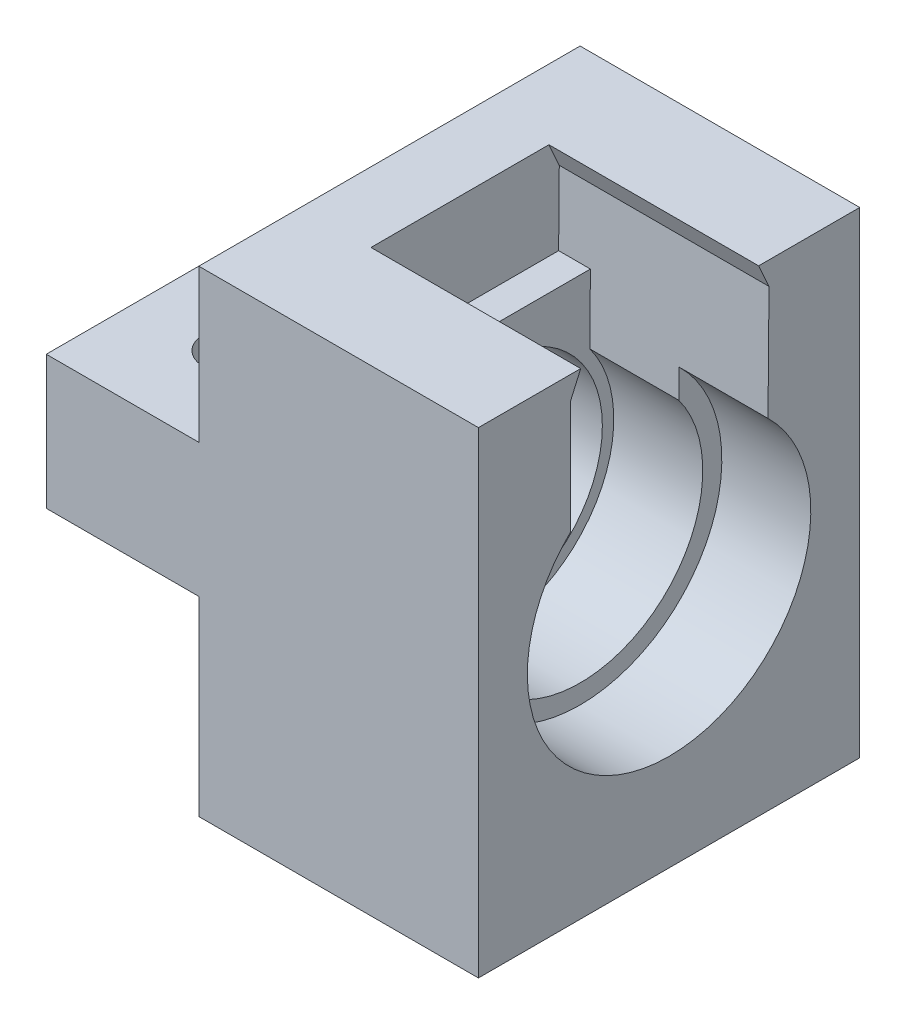
ISO-10303-21;
HEADER;
FILE_DESCRIPTION(('STEP AP214'),'2;1');
FILE_NAME('part.step','',(''),(''),'','','');
FILE_SCHEMA(('AUTOMOTIVE_DESIGN { 1 0 10303 214 1 1 1 1 }'));
ENDSEC;
DATA;
#1=APPLICATION_CONTEXT('core data for automotive mechanical design processes');
#2=APPLICATION_PROTOCOL_DEFINITION('international standard','automotive_design',2000,#1);
#3=PRODUCT_CONTEXT('',#1,'mechanical');
#4=PRODUCT('Part','Part','',(#3));
#5=PRODUCT_RELATED_PRODUCT_CATEGORY('part','',(#4));
#6=PRODUCT_DEFINITION_FORMATION('','',#4);
#7=PRODUCT_DEFINITION_CONTEXT('part definition',#1,'design');
#8=PRODUCT_DEFINITION('design','',#6,#7);
#9=PRODUCT_DEFINITION_SHAPE('','',#8);
#10=(LENGTH_UNIT() NAMED_UNIT(*) SI_UNIT(.MILLI.,.METRE.));
#11=(NAMED_UNIT(*) PLANE_ANGLE_UNIT() SI_UNIT($,.RADIAN.));
#12=(NAMED_UNIT(*) SI_UNIT($,.STERADIAN.) SOLID_ANGLE_UNIT());
#13=UNCERTAINTY_MEASURE_WITH_UNIT(LENGTH_MEASURE(1.E-05),#10,'distance_accuracy_value','');
#14=(GEOMETRIC_REPRESENTATION_CONTEXT(3) GLOBAL_UNCERTAINTY_ASSIGNED_CONTEXT((#13)) GLOBAL_UNIT_ASSIGNED_CONTEXT((#10,
#11,#12)) REPRESENTATION_CONTEXT('',''));
#15=CARTESIAN_POINT('',(0.,0.,0.));
#16=DIRECTION('',(0.,0.,1.));
#17=DIRECTION('',(1.,0.,0.));
#18=AXIS2_PLACEMENT_3D('',#15,#16,#17);
#19=CARTESIAN_POINT('',(-34.,6.75,30.));
#20=DIRECTION('',(0.,-1.,0.));
#21=DIRECTION('',(1.,0.,0.));
#22=AXIS2_PLACEMENT_3D('',#19,#20,#21);
#23=PLANE('',#22);
#24=DIRECTION('',(-1.,0.,0.));
#25=VECTOR('',#24,1.);
#26=CARTESIAN_POINT('',(-34.,6.75,0.));
#27=LINE('',#26,#25);
#28=CARTESIAN_POINT('',(-22.,6.75,0.));
#29=VERTEX_POINT('',#28);
#30=CARTESIAN_POINT('',(-34.,6.75,0.));
#31=VERTEX_POINT('',#30);
#32=EDGE_CURVE('E173',#29,#31,#27,.T.);
#33=ORIENTED_EDGE('',*,*,#32,.T.);
#34=DIRECTION('',(0.,0.,-1.));
#35=VECTOR('',#34,1.);
#36=CARTESIAN_POINT('',(-34.,6.75,30.));
#37=LINE('',#36,#35);
#38=CARTESIAN_POINT('',(-34.,6.75,30.));
#39=VERTEX_POINT('',#38);
#40=EDGE_CURVE('E193',#39,#31,#37,.T.);
#41=ORIENTED_EDGE('',*,*,#40,.F.);
#42=DIRECTION('',(-1.,0.,0.));
#43=VECTOR('',#42,1.);
#44=CARTESIAN_POINT('',(-34.,6.75,30.));
#45=LINE('',#44,#43);
#46=CARTESIAN_POINT('',(-22.,6.75,30.));
#47=VERTEX_POINT('',#46);
#48=EDGE_CURVE('E202',#47,#39,#45,.T.);
#49=ORIENTED_EDGE('',*,*,#48,.F.);
#50=DIRECTION('',(0.,0.,-1.));
#51=VECTOR('',#50,1.);
#52=CARTESIAN_POINT('',(-22.,6.75,30.));
#53=LINE('',#52,#51);
#54=EDGE_CURVE('E67',#47,#29,#53,.T.);
#55=ORIENTED_EDGE('',*,*,#54,.T.);
#56=EDGE_LOOP('',(#33,#41,#49,#55));
#57=FACE_BOUND('',#56,.T.);
#58=CARTESIAN_POINT('',(-27.,6.75,22.5));
#59=DIRECTION('',(0.,1.,0.));
#60=DIRECTION('',(0.,0.,1.));
#61=AXIS2_PLACEMENT_3D('',#58,#59,#60);
#62=CIRCLE('',#61,2.15);
#63=CARTESIAN_POINT('',(-27.,6.75,24.65));
#64=VERTEX_POINT('',#63);
#65=EDGE_CURVE('E309',#64,#64,#62,.F.);
#66=ORIENTED_EDGE('',*,*,#65,.T.);
#67=EDGE_LOOP('',(#66));
#68=FACE_BOUND('',#67,.T.);
#69=CARTESIAN_POINT('',(-27.,6.75,7.5));
#70=DIRECTION('',(0.,1.,0.));
#71=DIRECTION('',(0.,0.,1.));
#72=AXIS2_PLACEMENT_3D('',#69,#70,#71);
#73=CIRCLE('',#72,2.15);
#74=CARTESIAN_POINT('',(-27.,6.75,9.65));
#75=VERTEX_POINT('',#74);
#76=EDGE_CURVE('E312',#75,#75,#73,.T.);
#77=ORIENTED_EDGE('',*,*,#76,.F.);
#78=EDGE_LOOP('',(#77));
#79=FACE_BOUND('',#78,.T.);
#80=ADVANCED_FACE('F58',(#57,#68,#79),#23,.F.);
#81=CARTESIAN_POINT('',(-22.,-3.75,30.));
#82=DIRECTION('',(0.,1.,0.));
#83=DIRECTION('',(-1.,0.,0.));
#84=AXIS2_PLACEMENT_3D('',#81,#82,#83);
#85=PLANE('',#84);
#86=DIRECTION('',(1.,0.,0.));
#87=VECTOR('',#86,1.);
#88=CARTESIAN_POINT('',(-22.,-3.75,0.));
#89=LINE('',#88,#87);
#90=CARTESIAN_POINT('',(-34.,-3.75,0.));
#91=VERTEX_POINT('',#90);
#92=CARTESIAN_POINT('',(-22.,-3.75,0.));
#93=VERTEX_POINT('',#92);
#94=EDGE_CURVE('E177',#91,#93,#89,.T.);
#95=ORIENTED_EDGE('',*,*,#94,.T.);
#96=DIRECTION('',(0.,0.,-1.));
#97=VECTOR('',#96,1.);
#98=CARTESIAN_POINT('',(-22.,-3.75,30.));
#99=LINE('',#98,#97);
#100=CARTESIAN_POINT('',(-22.,-3.75,30.));
#101=VERTEX_POINT('',#100);
#102=EDGE_CURVE('E159',#101,#93,#99,.T.);
#103=ORIENTED_EDGE('',*,*,#102,.F.);
#104=DIRECTION('',(1.,0.,0.));
#105=VECTOR('',#104,1.);
#106=CARTESIAN_POINT('',(-22.,-3.75,30.));
#107=LINE('',#106,#105);
#108=CARTESIAN_POINT('',(-34.,-3.75,30.));
#109=VERTEX_POINT('',#108);
#110=EDGE_CURVE('E147',#109,#101,#107,.T.);
#111=ORIENTED_EDGE('',*,*,#110,.F.);
#112=DIRECTION('',(0.,0.,-1.));
#113=VECTOR('',#112,1.);
#114=CARTESIAN_POINT('',(-34.,-3.75,30.));
#115=LINE('',#114,#113);
#116=EDGE_CURVE('E190',#109,#91,#115,.T.);
#117=ORIENTED_EDGE('',*,*,#116,.T.);
#118=EDGE_LOOP('',(#95,#103,#111,#117));
#119=FACE_BOUND('',#118,.T.);
#120=CARTESIAN_POINT('',(-27.,-3.75,22.5));
#121=DIRECTION('',(0.,1.,0.));
#122=DIRECTION('',(-1.,0.,0.));
#123=AXIS2_PLACEMENT_3D('',#120,#121,#122);
#124=CIRCLE('',#123,2.15);
#125=CARTESIAN_POINT('',(-29.15,-3.75,22.5));
#126=VERTEX_POINT('',#125);
#127=EDGE_CURVE('E306',#126,#126,#124,.T.);
#128=ORIENTED_EDGE('',*,*,#127,.T.);
#129=EDGE_LOOP('',(#128));
#130=FACE_BOUND('',#129,.T.);
#131=CARTESIAN_POINT('',(-27.,-3.75,7.5));
#132=DIRECTION('',(0.,1.,0.));
#133=DIRECTION('',(-1.,0.,0.));
#134=AXIS2_PLACEMENT_3D('',#131,#132,#133);
#135=CIRCLE('',#134,2.15);
#136=CARTESIAN_POINT('',(-29.15,-3.75,7.5));
#137=VERTEX_POINT('',#136);
#138=EDGE_CURVE('E305',#137,#137,#135,.F.);
#139=ORIENTED_EDGE('',*,*,#138,.F.);
#140=EDGE_LOOP('',(#139));
#141=FACE_BOUND('',#140,.T.);
#142=ADVANCED_FACE('F213',(#119,#130,#141),#85,.F.);
#143=CARTESIAN_POINT('',(-22.,18.75,30.));
#144=DIRECTION('',(0.,-1.,0.));
#145=DIRECTION('',(1.,0.,0.));
#146=AXIS2_PLACEMENT_3D('',#143,#144,#145);
#147=PLANE('',#146);
#148=DIRECTION('',(1.,0.,0.));
#149=VECTOR('',#148,1.);
#150=CARTESIAN_POINT('',(-14.,18.75,21.9532092170405));
#151=LINE('',#150,#149);
#152=CARTESIAN_POINT('',(-16.5,18.75,21.9532092170405));
#153=VERTEX_POINT('',#152);
#154=CARTESIAN_POINT('',(0.,18.75,21.9532092170405));
#155=VERTEX_POINT('',#154);
#156=EDGE_CURVE('E241',#153,#155,#151,.T.);
#157=ORIENTED_EDGE('',*,*,#156,.F.);
#158=DIRECTION('',(0.,0.,1.));
#159=VECTOR('',#158,1.);
#160=CARTESIAN_POINT('',(-16.5,18.75,0.));
#161=LINE('',#160,#159);
#162=CARTESIAN_POINT('',(-16.5,18.75,7.95210770828627));
#163=VERTEX_POINT('',#162);
#164=EDGE_CURVE('E285',#163,#153,#161,.T.);
#165=ORIENTED_EDGE('',*,*,#164,.F.);
#166=DIRECTION('',(1.,0.,0.));
#167=VECTOR('',#166,1.);
#168=CARTESIAN_POINT('',(-14.,18.75,7.95210770828627));
#169=LINE('',#168,#167);
#170=CARTESIAN_POINT('',(0.,18.75,7.95210770828627));
#171=VERTEX_POINT('',#170);
#172=EDGE_CURVE('E238',#163,#171,#169,.T.);
#173=ORIENTED_EDGE('',*,*,#172,.T.);
#174=DIRECTION('',(0.,0.,-1.));
#175=VECTOR('',#174,1.);
#176=CARTESIAN_POINT('',(0.,18.75,30.));
#177=LINE('',#176,#175);
#178=CARTESIAN_POINT('',(0.,18.75,0.));
#179=VERTEX_POINT('',#178);
#180=EDGE_CURVE('E117',#171,#179,#177,.T.);
#181=ORIENTED_EDGE('',*,*,#180,.T.);
#182=DIRECTION('',(-1.,0.,0.));
#183=VECTOR('',#182,1.);
#184=CARTESIAN_POINT('',(-22.,18.75,0.));
#185=LINE('',#184,#183);
#186=CARTESIAN_POINT('',(-22.,18.75,0.));
#187=VERTEX_POINT('',#186);
#188=EDGE_CURVE('E168',#179,#187,#185,.T.);
#189=ORIENTED_EDGE('',*,*,#188,.T.);
#190=DIRECTION('',(0.,0.,-1.));
#191=VECTOR('',#190,1.);
#192=CARTESIAN_POINT('',(-22.,18.75,30.));
#193=LINE('',#192,#191);
#194=CARTESIAN_POINT('',(-22.,18.75,30.));
#195=VERTEX_POINT('',#194);
#196=EDGE_CURVE('E12',#195,#187,#193,.T.);
#197=ORIENTED_EDGE('',*,*,#196,.F.);
#198=DIRECTION('',(-1.,0.,0.));
#199=VECTOR('',#198,1.);
#200=CARTESIAN_POINT('',(-22.,18.75,30.));
#201=LINE('',#200,#199);
#202=CARTESIAN_POINT('',(0.,18.75,30.));
#203=VERTEX_POINT('',#202);
#204=EDGE_CURVE('E184',#203,#195,#201,.T.);
#205=ORIENTED_EDGE('',*,*,#204,.F.);
#206=EDGE_CURVE('E185',#203,#155,#177,.T.);
#207=ORIENTED_EDGE('',*,*,#206,.T.);
#208=EDGE_LOOP('',(#157,#165,#173,#181,#189,#197,#205,#207));
#209=FACE_BOUND('',#208,.T.);
#210=ADVANCED_FACE('F60',(#209),#147,.F.);
#211=CARTESIAN_POINT('',(-14.,0.,15.));
#212=DIRECTION('',(1.,0.,0.));
#213=DIRECTION('',(0.,0.,-1.));
#214=AXIS2_PLACEMENT_3D('',#211,#212,#213);
#215=CYLINDRICAL_SURFACE('',#214,9.65);
#216=CARTESIAN_POINT('',(-7.,0.,15.));
#217=DIRECTION('',(1.,0.,0.));
#218=DIRECTION('',(0.,0.,-1.));
#219=AXIS2_PLACEMENT_3D('',#216,#217,#218);
#220=CIRCLE('',#219,9.65);
#221=CARTESIAN_POINT('',(-7.,5.74671012070965,22.7522785546272));
#222=VERTEX_POINT('',#221);
#223=CARTESIAN_POINT('',(-7.,5.73268595831545,7.23734506091293));
#224=VERTEX_POINT('',#223);
#225=EDGE_CURVE('E270',#222,#224,#220,.T.);
#226=ORIENTED_EDGE('',*,*,#225,.T.);
#227=DIRECTION('',(1.,0.,0.));
#228=VECTOR('',#227,1.);
#229=CARTESIAN_POINT('',(-14.,5.73268595831545,7.23734506091293));
#230=LINE('',#229,#228);
#231=CARTESIAN_POINT('',(-14.,5.73268595831545,7.23734506091293));
#232=VERTEX_POINT('',#231);
#233=EDGE_CURVE('E226',#224,#232,#230,.F.);
#234=ORIENTED_EDGE('',*,*,#233,.T.);
#235=CARTESIAN_POINT('',(-14.,0.,15.));
#236=DIRECTION('',(1.,0.,0.));
#237=DIRECTION('',(0.,0.,-1.));
#238=AXIS2_PLACEMENT_3D('',#235,#236,#237);
#239=CIRCLE('',#238,9.65);
#240=CARTESIAN_POINT('',(-14.,5.74671012070965,22.7522785546272));
#241=VERTEX_POINT('',#240);
#242=EDGE_CURVE('E230',#241,#232,#239,.T.);
#243=ORIENTED_EDGE('',*,*,#242,.F.);
#244=DIRECTION('',(1.,0.,0.));
#245=VECTOR('',#244,1.);
#246=CARTESIAN_POINT('',(-14.,5.74671012070965,22.7522785546272));
#247=LINE('',#246,#245);
#248=EDGE_CURVE('E223',#222,#241,#247,.F.);
#249=ORIENTED_EDGE('',*,*,#248,.F.);
#250=EDGE_LOOP('',(#226,#234,#243,#249));
#251=FACE_BOUND('',#250,.T.);
#252=ADVANCED_FACE('F335',(#251),#215,.F.);
#253=CARTESIAN_POINT('',(0.,18.75,30.));
#254=DIRECTION('',(-1.,0.,0.));
#255=DIRECTION('',(0.,0.,1.));
#256=AXIS2_PLACEMENT_3D('',#253,#254,#255);
#257=PLANE('',#256);
#258=DIRECTION('',(0.,-0.999961655665334,0.00875712276062912));
#259=VECTOR('',#258,1.);
#260=CARTESIAN_POINT('',(0.,0.0638155125891131,7.28698995892084));
#261=LINE('',#260,#259);
#262=CARTESIAN_POINT('',(0.,16.9402011889184,7.13919571072539));
#263=VERTEX_POINT('',#262);
#264=CARTESIAN_POINT('',(0.,7.98480408284201,7.21762222976617));
#265=VERTEX_POINT('',#264);
#266=EDGE_CURVE('E233',#263,#265,#261,.T.);
#267=ORIENTED_EDGE('',*,*,#266,.T.);
#268=CARTESIAN_POINT('',(0.,0.,15.));
#269=DIRECTION('',(1.,0.,0.));
#270=DIRECTION('',(0.,0.,-1.));
#271=AXIS2_PLACEMENT_3D('',#268,#269,#270);
#272=CIRCLE('',#271,11.15);
#273=CARTESIAN_POINT('',(0.,8.01495462369594,22.7513226213399));
#274=VERTEX_POINT('',#273);
#275=EDGE_CURVE('E267',#274,#265,#272,.T.);
#276=ORIENTED_EDGE('',*,*,#275,.F.);
#277=DIRECTION('',(0.,-0.999999911193372,0.000421441868906497));
#278=VECTOR('',#277,1.);
#279=CARTESIAN_POINT('',(0.,0.00958978263625245,22.7546964175594));
#280=LINE('',#279,#278);
#281=CARTESIAN_POINT('',(0.,16.9472308597508,22.747558185815));
#282=VERTEX_POINT('',#281);
#283=EDGE_CURVE('E246',#282,#274,#280,.T.);
#284=ORIENTED_EDGE('',*,*,#283,.F.);
#285=DIRECTION('',(0.,0.915103356382747,-0.403219353624094));
#286=VECTOR('',#285,1.);
#287=CARTESIAN_POINT('',(0.,11.1489418701439,25.3024415464844));
#288=LINE('',#287,#286);
#289=EDGE_CURVE('E250',#282,#155,#288,.T.);
#290=ORIENTED_EDGE('',*,*,#289,.T.);
#291=ORIENTED_EDGE('',*,*,#206,.F.);
#292=DIRECTION('',(0.,1.,0.));
#293=VECTOR('',#292,1.);
#294=CARTESIAN_POINT('',(0.,18.75,30.));
#295=LINE('',#294,#293);
#296=CARTESIAN_POINT('',(0.,-18.75,30.));
#297=VERTEX_POINT('',#296);
#298=EDGE_CURVE('E83',#297,#203,#295,.T.);
#299=ORIENTED_EDGE('',*,*,#298,.F.);
#300=DIRECTION('',(0.,0.,-1.));
#301=VECTOR('',#300,1.);
#302=CARTESIAN_POINT('',(0.,-18.75,30.));
#303=LINE('',#302,#301);
#304=CARTESIAN_POINT('',(0.,-18.75,0.));
#305=VERTEX_POINT('',#304);
#306=EDGE_CURVE('E160',#297,#305,#303,.T.);
#307=ORIENTED_EDGE('',*,*,#306,.T.);
#308=DIRECTION('',(0.,1.,0.));
#309=VECTOR('',#308,1.);
#310=CARTESIAN_POINT('',(0.,18.75,0.));
#311=LINE('',#310,#309);
#312=EDGE_CURVE('E182',#305,#179,#311,.T.);
#313=ORIENTED_EDGE('',*,*,#312,.T.);
#314=ORIENTED_EDGE('',*,*,#180,.F.);
#315=DIRECTION('',(0.,0.912203742273716,0.409736906541048));
#316=VECTOR('',#315,1.);
#317=CARTESIAN_POINT('',(0.,0.17562331241949,-0.390992952458178));
#318=LINE('',#317,#316);
#319=EDGE_CURVE('E253',#263,#171,#318,.T.);
#320=ORIENTED_EDGE('',*,*,#319,.F.);
#321=EDGE_LOOP('',(#267,#276,#284,#290,#291,#299,#307,#313,#314,#320));
#322=FACE_BOUND('',#321,.T.);
#323=ADVANCED_FACE('F330',(#322),#257,.F.);
#324=CARTESIAN_POINT('',(-22.,6.75,30.));
#325=DIRECTION('',(1.,0.,0.));
#326=DIRECTION('',(0.,0.,-1.));
#327=AXIS2_PLACEMENT_3D('',#324,#325,#326);
#328=PLANE('',#327);
#329=DIRECTION('',(0.,-1.,0.));
#330=VECTOR('',#329,1.);
#331=CARTESIAN_POINT('',(-22.,6.75,0.));
#332=LINE('',#331,#330);
#333=EDGE_CURVE('E170',#187,#29,#332,.T.);
#334=ORIENTED_EDGE('',*,*,#333,.T.);
#335=ORIENTED_EDGE('',*,*,#54,.F.);
#336=DIRECTION('',(0.,-1.,0.));
#337=VECTOR('',#336,1.);
#338=CARTESIAN_POINT('',(-22.,6.75,30.));
#339=LINE('',#338,#337);
#340=EDGE_CURVE('E125',#195,#47,#339,.T.);
#341=ORIENTED_EDGE('',*,*,#340,.F.);
#342=ORIENTED_EDGE('',*,*,#196,.T.);
#343=EDGE_LOOP('',(#334,#335,#341,#342));
#344=FACE_BOUND('',#343,.T.);
#345=ADVANCED_FACE('F328',(#344),#328,.F.);
#346=CARTESIAN_POINT('',(-34.,-3.75,30.));
#347=DIRECTION('',(1.,0.,0.));
#348=DIRECTION('',(0.,0.,-1.));
#349=AXIS2_PLACEMENT_3D('',#346,#347,#348);
#350=PLANE('',#349);
#351=DIRECTION('',(0.,-1.,0.));
#352=VECTOR('',#351,1.);
#353=CARTESIAN_POINT('',(-34.,-3.75,0.));
#354=LINE('',#353,#352);
#355=EDGE_CURVE('E175',#31,#91,#354,.T.);
#356=ORIENTED_EDGE('',*,*,#355,.T.);
#357=ORIENTED_EDGE('',*,*,#116,.F.);
#358=DIRECTION('',(0.,-1.,0.));
#359=VECTOR('',#358,1.);
#360=CARTESIAN_POINT('',(-34.,-3.75,30.));
#361=LINE('',#360,#359);
#362=EDGE_CURVE('E215',#39,#109,#361,.T.);
#363=ORIENTED_EDGE('',*,*,#362,.F.);
#364=ORIENTED_EDGE('',*,*,#40,.T.);
#365=EDGE_LOOP('',(#356,#357,#363,#364));
#366=FACE_BOUND('',#365,.T.);
#367=ADVANCED_FACE('F210',(#366),#350,.F.);
#368=CARTESIAN_POINT('',(-22.,-18.75,30.));
#369=DIRECTION('',(1.,0.,0.));
#370=DIRECTION('',(0.,0.,-1.));
#371=AXIS2_PLACEMENT_3D('',#368,#369,#370);
#372=PLANE('',#371);
#373=DIRECTION('',(0.,-1.,0.));
#374=VECTOR('',#373,1.);
#375=CARTESIAN_POINT('',(-22.,-18.75,0.));
#376=LINE('',#375,#374);
#377=CARTESIAN_POINT('',(-22.,-18.75,0.));
#378=VERTEX_POINT('',#377);
#379=EDGE_CURVE('E156',#93,#378,#376,.T.);
#380=ORIENTED_EDGE('',*,*,#379,.T.);
#381=DIRECTION('',(0.,0.,-1.));
#382=VECTOR('',#381,1.);
#383=CARTESIAN_POINT('',(-22.,-18.75,30.));
#384=LINE('',#383,#382);
#385=CARTESIAN_POINT('',(-22.,-18.75,30.));
#386=VERTEX_POINT('',#385);
#387=EDGE_CURVE('E153',#386,#378,#384,.T.);
#388=ORIENTED_EDGE('',*,*,#387,.F.);
#389=DIRECTION('',(0.,-1.,0.));
#390=VECTOR('',#389,1.);
#391=CARTESIAN_POINT('',(-22.,-18.75,30.));
#392=LINE('',#391,#390);
#393=EDGE_CURVE('E140',#101,#386,#392,.T.);
#394=ORIENTED_EDGE('',*,*,#393,.F.);
#395=ORIENTED_EDGE('',*,*,#102,.T.);
#396=EDGE_LOOP('',(#380,#388,#394,#395));
#397=FACE_BOUND('',#396,.T.);
#398=ADVANCED_FACE('F154',(#397),#372,.F.);
#399=CARTESIAN_POINT('',(0.,-18.75,30.));
#400=DIRECTION('',(0.,1.,0.));
#401=DIRECTION('',(0.,0.,1.));
#402=AXIS2_PLACEMENT_3D('',#399,#400,#401);
#403=PLANE('',#402);
#404=DIRECTION('',(1.,0.,0.));
#405=VECTOR('',#404,1.);
#406=CARTESIAN_POINT('',(0.,-18.75,0.));
#407=LINE('',#406,#405);
#408=EDGE_CURVE('E180',#378,#305,#407,.T.);
#409=ORIENTED_EDGE('',*,*,#408,.T.);
#410=ORIENTED_EDGE('',*,*,#306,.F.);
#411=DIRECTION('',(1.,0.,0.));
#412=VECTOR('',#411,1.);
#413=CARTESIAN_POINT('',(0.,-18.75,30.));
#414=LINE('',#413,#412);
#415=EDGE_CURVE('E144',#386,#297,#414,.T.);
#416=ORIENTED_EDGE('',*,*,#415,.F.);
#417=ORIENTED_EDGE('',*,*,#387,.T.);
#418=EDGE_LOOP('',(#409,#410,#416,#417));
#419=FACE_BOUND('',#418,.T.);
#420=ADVANCED_FACE('F162',(#419),#403,.F.);
#421=CARTESIAN_POINT('',(0.,0.,30.));
#422=DIRECTION('',(0.,0.,-1.));
#423=DIRECTION('',(-1.,0.,0.));
#424=AXIS2_PLACEMENT_3D('',#421,#422,#423);
#425=PLANE('',#424);
#426=ORIENTED_EDGE('',*,*,#204,.T.);
#427=ORIENTED_EDGE('',*,*,#340,.T.);
#428=ORIENTED_EDGE('',*,*,#48,.T.);
#429=ORIENTED_EDGE('',*,*,#362,.T.);
#430=ORIENTED_EDGE('',*,*,#110,.T.);
#431=ORIENTED_EDGE('',*,*,#393,.T.);
#432=ORIENTED_EDGE('',*,*,#415,.T.);
#433=ORIENTED_EDGE('',*,*,#298,.T.);
#434=EDGE_LOOP('',(#426,#427,#428,#429,#430,#431,#432,#433));
#435=FACE_BOUND('',#434,.T.);
#436=ADVANCED_FACE('F142',(#435),#425,.F.);
#437=CARTESIAN_POINT('',(0.,0.,0.));
#438=DIRECTION('',(0.,0.,-1.));
#439=DIRECTION('',(-1.,0.,0.));
#440=AXIS2_PLACEMENT_3D('',#437,#438,#439);
#441=PLANE('',#440);
#442=ORIENTED_EDGE('',*,*,#188,.F.);
#443=ORIENTED_EDGE('',*,*,#312,.F.);
#444=ORIENTED_EDGE('',*,*,#408,.F.);
#445=ORIENTED_EDGE('',*,*,#379,.F.);
#446=ORIENTED_EDGE('',*,*,#94,.F.);
#447=ORIENTED_EDGE('',*,*,#355,.F.);
#448=ORIENTED_EDGE('',*,*,#32,.F.);
#449=ORIENTED_EDGE('',*,*,#333,.F.);
#450=EDGE_LOOP('',(#442,#443,#444,#445,#446,#447,#448,#449));
#451=FACE_BOUND('',#450,.T.);
#452=ADVANCED_FACE('F206',(#451),#441,.T.);
#453=CARTESIAN_POINT('',(-14.,0.,0.));
#454=DIRECTION('',(1.,0.,0.));
#455=DIRECTION('',(0.,0.,-1.));
#456=AXIS2_PLACEMENT_3D('',#453,#454,#455);
#457=PLANE('',#456);
#458=DIRECTION('',(0.,0.,-1.));
#459=VECTOR('',#458,1.);
#460=CARTESIAN_POINT('',(-14.,11.15,0.));
#461=LINE('',#460,#459);
#462=CARTESIAN_POINT('',(-14.,11.15,22.75000138184));
#463=VERTEX_POINT('',#462);
#464=CARTESIAN_POINT('',(-14.,11.15,7.1899031576888));
#465=VERTEX_POINT('',#464);
#466=EDGE_CURVE('E271',#463,#465,#461,.T.);
#467=ORIENTED_EDGE('',*,*,#466,.F.);
#468=DIRECTION('',(0.,-0.999999911193372,0.000421441868906497));
#469=VECTOR('',#468,1.);
#470=CARTESIAN_POINT('',(-14.,0.00958978263625245,22.7546964175594));
#471=LINE('',#470,#469);
#472=EDGE_CURVE('E239',#463,#241,#471,.T.);
#473=ORIENTED_EDGE('',*,*,#472,.T.);
#474=ORIENTED_EDGE('',*,*,#242,.T.);
#475=DIRECTION('',(0.,-0.999961655665334,0.00875712276062912));
#476=VECTOR('',#475,1.);
#477=CARTESIAN_POINT('',(-14.,0.0638155125891131,7.28698995892084));
#478=LINE('',#477,#476);
#479=EDGE_CURVE('E249',#465,#232,#478,.T.);
#480=ORIENTED_EDGE('',*,*,#479,.F.);
#481=EDGE_LOOP('',(#467,#473,#474,#480));
#482=FACE_BOUND('',#481,.T.);
#483=CARTESIAN_POINT('',(-14.,0.,15.));
#484=DIRECTION('',(1.,0.,0.));
#485=DIRECTION('',(0.,0.,-1.));
#486=AXIS2_PLACEMENT_3D('',#483,#484,#485);
#487=CIRCLE('',#486,8.75);
#488=CARTESIAN_POINT('',(-14.,0.,6.25));
#489=VERTEX_POINT('',#488);
#490=EDGE_CURVE('E62',#489,#489,#487,.F.);
#491=ORIENTED_EDGE('',*,*,#490,.T.);
#492=EDGE_LOOP('',(#491));
#493=FACE_BOUND('',#492,.T.);
#494=ADVANCED_FACE('F369',(#482,#493),#457,.T.);
#495=CARTESIAN_POINT('',(-14.,0.00958978263625245,22.7546964175594));
#496=DIRECTION('',(0.,0.000421441868906497,0.999999911193372));
#497=DIRECTION('',(0.,-0.999999911193372,0.000421441868906497));
#498=AXIS2_PLACEMENT_3D('',#495,#496,#497);
#499=PLANE('',#498);
#500=ORIENTED_EDGE('',*,*,#472,.F.);
#501=DIRECTION('',(1.,0.,0.));
#502=VECTOR('',#501,1.);
#503=CARTESIAN_POINT('',(-16.5,11.15,22.75000138184));
#504=LINE('',#503,#502);
#505=CARTESIAN_POINT('',(-16.5,11.15,22.75000138184));
#506=VERTEX_POINT('',#505);
#507=EDGE_CURVE('E282',#506,#463,#504,.T.);
#508=ORIENTED_EDGE('',*,*,#507,.F.);
#509=DIRECTION('',(0.,-0.999999911193372,0.000421441868906497));
#510=VECTOR('',#509,1.);
#511=CARTESIAN_POINT('',(-16.5,0.00958978263625245,22.7546964175594));
#512=LINE('',#511,#510);
#513=CARTESIAN_POINT('',(-16.5,16.9472308597508,22.747558185815));
#514=VERTEX_POINT('',#513);
#515=EDGE_CURVE('E299',#514,#506,#512,.T.);
#516=ORIENTED_EDGE('',*,*,#515,.F.);
#517=DIRECTION('',(1.,0.,0.));
#518=VECTOR('',#517,1.);
#519=CARTESIAN_POINT('',(-14.,16.9472308597508,22.747558185815));
#520=LINE('',#519,#518);
#521=EDGE_CURVE('E229',#514,#282,#520,.T.);
#522=ORIENTED_EDGE('',*,*,#521,.T.);
#523=ORIENTED_EDGE('',*,*,#283,.T.);
#524=DIRECTION('',(1.,0.,0.));
#525=VECTOR('',#524,1.);
#526=CARTESIAN_POINT('',(-7.,8.01495462369594,22.7513226213399));
#527=LINE('',#526,#525);
#528=CARTESIAN_POINT('',(-7.,8.01495462369594,22.7513226213399));
#529=VERTEX_POINT('',#528);
#530=EDGE_CURVE('E262',#529,#274,#527,.T.);
#531=ORIENTED_EDGE('',*,*,#530,.F.);
#532=DIRECTION('',(0.,-0.999999911193372,0.000421441868906497));
#533=VECTOR('',#532,1.);
#534=CARTESIAN_POINT('',(-7.,0.00958978263625245,22.7546964175594));
#535=LINE('',#534,#533);
#536=EDGE_CURVE('E275',#529,#222,#535,.T.);
#537=ORIENTED_EDGE('',*,*,#536,.T.);
#538=ORIENTED_EDGE('',*,*,#248,.T.);
#539=EDGE_LOOP('',(#500,#508,#516,#522,#523,#531,#537,#538));
#540=FACE_BOUND('',#539,.T.);
#541=ADVANCED_FACE('F373',(#540),#499,.F.);
#542=CARTESIAN_POINT('',(-14.,11.1489418701439,25.3024415464844));
#543=DIRECTION('',(0.,-0.403219353624094,-0.915103356382747));
#544=DIRECTION('',(0.,0.915103356382747,-0.403219353624094));
#545=AXIS2_PLACEMENT_3D('',#542,#543,#544);
#546=PLANE('',#545);
#547=ORIENTED_EDGE('',*,*,#289,.F.);
#548=ORIENTED_EDGE('',*,*,#521,.F.);
#549=DIRECTION('',(0.,0.915103356382747,-0.403219353624094));
#550=VECTOR('',#549,1.);
#551=CARTESIAN_POINT('',(-16.5,11.1489418701439,25.3024415464844));
#552=LINE('',#551,#550);
#553=EDGE_CURVE('E302',#514,#153,#552,.T.);
#554=ORIENTED_EDGE('',*,*,#553,.T.);
#555=ORIENTED_EDGE('',*,*,#156,.T.);
#556=EDGE_LOOP('',(#547,#548,#554,#555));
#557=FACE_BOUND('',#556,.T.);
#558=ADVANCED_FACE('F431',(#557),#546,.T.);
#559=CARTESIAN_POINT('',(-14.,0.17562331241949,-0.390992952458178));
#560=DIRECTION('',(0.,0.409736906541048,-0.912203742273716));
#561=DIRECTION('',(0.,0.912203742273716,0.409736906541048));
#562=AXIS2_PLACEMENT_3D('',#559,#560,#561);
#563=PLANE('',#562);
#564=ORIENTED_EDGE('',*,*,#319,.T.);
#565=ORIENTED_EDGE('',*,*,#172,.F.);
#566=DIRECTION('',(0.,0.912203742273716,0.409736906541048));
#567=VECTOR('',#566,1.);
#568=CARTESIAN_POINT('',(-16.5,0.17562331241949,-0.390992952458178));
#569=LINE('',#568,#567);
#570=CARTESIAN_POINT('',(-16.5,16.9402011889184,7.13919571072539));
#571=VERTEX_POINT('',#570);
#572=EDGE_CURVE('E290',#571,#163,#569,.T.);
#573=ORIENTED_EDGE('',*,*,#572,.F.);
#574=DIRECTION('',(1.,0.,0.));
#575=VECTOR('',#574,1.);
#576=CARTESIAN_POINT('',(-14.,16.9402011889184,7.13919571072539));
#577=LINE('',#576,#575);
#578=EDGE_CURVE('E235',#571,#263,#577,.T.);
#579=ORIENTED_EDGE('',*,*,#578,.T.);
#580=EDGE_LOOP('',(#564,#565,#573,#579));
#581=FACE_BOUND('',#580,.T.);
#582=ADVANCED_FACE('F439',(#581),#563,.F.);
#583=CARTESIAN_POINT('',(-14.,0.0638155125891131,7.28698995892084));
#584=DIRECTION('',(0.,0.00875712276062911,0.999961655665334));
#585=DIRECTION('',(0.,-0.999961655665334,0.00875712276062912));
#586=AXIS2_PLACEMENT_3D('',#583,#584,#585);
#587=PLANE('',#586);
#588=DIRECTION('',(1.,0.,0.));
#589=VECTOR('',#588,1.);
#590=CARTESIAN_POINT('',(-7.,7.98480408284201,7.21762222976617));
#591=LINE('',#590,#589);
#592=CARTESIAN_POINT('',(-7.,7.98480408284201,7.21762222976617));
#593=VERTEX_POINT('',#592);
#594=EDGE_CURVE('E234',#593,#265,#591,.T.);
#595=ORIENTED_EDGE('',*,*,#594,.T.);
#596=ORIENTED_EDGE('',*,*,#266,.F.);
#597=ORIENTED_EDGE('',*,*,#578,.F.);
#598=DIRECTION('',(0.,-0.999961655665334,0.00875712276062912));
#599=VECTOR('',#598,1.);
#600=CARTESIAN_POINT('',(-16.5,0.0638155125891131,7.28698995892084));
#601=LINE('',#600,#599);
#602=CARTESIAN_POINT('',(-16.5,11.15,7.1899031576888));
#603=VERTEX_POINT('',#602);
#604=EDGE_CURVE('E293',#571,#603,#601,.T.);
#605=ORIENTED_EDGE('',*,*,#604,.T.);
#606=DIRECTION('',(1.,0.,0.));
#607=VECTOR('',#606,1.);
#608=CARTESIAN_POINT('',(-16.5,11.15,7.1899031576888));
#609=LINE('',#608,#607);
#610=EDGE_CURVE('E281',#603,#465,#609,.T.);
#611=ORIENTED_EDGE('',*,*,#610,.T.);
#612=ORIENTED_EDGE('',*,*,#479,.T.);
#613=ORIENTED_EDGE('',*,*,#233,.F.);
#614=DIRECTION('',(0.,-0.999961655665334,0.00875712276062912));
#615=VECTOR('',#614,1.);
#616=CARTESIAN_POINT('',(-7.,0.0638155125891131,7.28698995892084));
#617=LINE('',#616,#615);
#618=EDGE_CURVE('E74',#593,#224,#617,.T.);
#619=ORIENTED_EDGE('',*,*,#618,.F.);
#620=EDGE_LOOP('',(#595,#596,#597,#605,#611,#612,#613,#619));
#621=FACE_BOUND('',#620,.T.);
#622=ADVANCED_FACE('F363',(#621),#587,.T.);
#623=CARTESIAN_POINT('',(-19.,0.,0.));
#624=DIRECTION('',(1.,0.,0.));
#625=DIRECTION('',(0.,0.,-1.));
#626=AXIS2_PLACEMENT_3D('',#623,#624,#625);
#627=PLANE('',#626);
#628=CARTESIAN_POINT('',(-19.,0.,15.));
#629=DIRECTION('',(1.,0.,0.));
#630=DIRECTION('',(0.,0.,-1.));
#631=AXIS2_PLACEMENT_3D('',#628,#629,#630);
#632=CIRCLE('',#631,8.75);
#633=CARTESIAN_POINT('',(-19.,0.,6.25));
#634=VERTEX_POINT('',#633);
#635=EDGE_CURVE('E171',#634,#634,#632,.T.);
#636=ORIENTED_EDGE('',*,*,#635,.T.);
#637=EDGE_LOOP('',(#636));
#638=FACE_BOUND('',#637,.T.);
#639=ADVANCED_FACE('F381',(#638),#627,.T.);
#640=CARTESIAN_POINT('',(-19.,0.,15.));
#641=DIRECTION('',(1.,0.,0.));
#642=DIRECTION('',(0.,0.,-1.));
#643=AXIS2_PLACEMENT_3D('',#640,#641,#642);
#644=CYLINDRICAL_SURFACE('',#643,8.75);
#645=ORIENTED_EDGE('',*,*,#635,.F.);
#646=EDGE_LOOP('',(#645));
#647=FACE_BOUND('',#646,.T.);
#648=ORIENTED_EDGE('',*,*,#490,.F.);
#649=EDGE_LOOP('',(#648));
#650=FACE_BOUND('',#649,.T.);
#651=ADVANCED_FACE('F378',(#647,#650),#644,.F.);
#652=CARTESIAN_POINT('',(-7.,0.,15.));
#653=DIRECTION('',(1.,0.,0.));
#654=DIRECTION('',(0.,0.,-1.));
#655=AXIS2_PLACEMENT_3D('',#652,#653,#654);
#656=CYLINDRICAL_SURFACE('',#655,11.15);
#657=ORIENTED_EDGE('',*,*,#275,.T.);
#658=ORIENTED_EDGE('',*,*,#594,.F.);
#659=CARTESIAN_POINT('',(-7.,0.,15.));
#660=DIRECTION('',(1.,0.,0.));
#661=DIRECTION('',(0.,0.,-1.));
#662=AXIS2_PLACEMENT_3D('',#659,#660,#661);
#663=CIRCLE('',#662,11.15);
#664=EDGE_CURVE('E273',#529,#593,#663,.T.);
#665=ORIENTED_EDGE('',*,*,#664,.F.);
#666=ORIENTED_EDGE('',*,*,#530,.T.);
#667=EDGE_LOOP('',(#657,#658,#665,#666));
#668=FACE_BOUND('',#667,.T.);
#669=ADVANCED_FACE('F380',(#668),#656,.F.);
#670=CARTESIAN_POINT('',(-7.,0.,0.));
#671=DIRECTION('',(1.,0.,0.));
#672=DIRECTION('',(0.,0.,-1.));
#673=AXIS2_PLACEMENT_3D('',#670,#671,#672);
#674=PLANE('',#673);
#675=ORIENTED_EDGE('',*,*,#225,.F.);
#676=ORIENTED_EDGE('',*,*,#536,.F.);
#677=ORIENTED_EDGE('',*,*,#664,.T.);
#678=ORIENTED_EDGE('',*,*,#618,.T.);
#679=EDGE_LOOP('',(#675,#676,#677,#678));
#680=FACE_BOUND('',#679,.T.);
#681=ADVANCED_FACE('F388',(#680),#674,.T.);
#682=CARTESIAN_POINT('',(-16.5,11.15,0.));
#683=DIRECTION('',(0.,-1.,0.));
#684=DIRECTION('',(0.,0.,-1.));
#685=AXIS2_PLACEMENT_3D('',#682,#683,#684);
#686=PLANE('',#685);
#687=ORIENTED_EDGE('',*,*,#466,.T.);
#688=ORIENTED_EDGE('',*,*,#610,.F.);
#689=DIRECTION('',(0.,0.,-1.));
#690=VECTOR('',#689,1.);
#691=CARTESIAN_POINT('',(-16.5,11.15,0.));
#692=LINE('',#691,#690);
#693=EDGE_CURVE('E296',#506,#603,#692,.T.);
#694=ORIENTED_EDGE('',*,*,#693,.F.);
#695=ORIENTED_EDGE('',*,*,#507,.T.);
#696=EDGE_LOOP('',(#687,#688,#694,#695));
#697=FACE_BOUND('',#696,.T.);
#698=ADVANCED_FACE('F488',(#697),#686,.F.);
#699=CARTESIAN_POINT('',(-16.5,0.,0.));
#700=DIRECTION('',(1.,0.,0.));
#701=DIRECTION('',(0.,0.,-1.));
#702=AXIS2_PLACEMENT_3D('',#699,#700,#701);
#703=PLANE('',#702);
#704=ORIENTED_EDGE('',*,*,#553,.F.);
#705=ORIENTED_EDGE('',*,*,#515,.T.);
#706=ORIENTED_EDGE('',*,*,#693,.T.);
#707=ORIENTED_EDGE('',*,*,#604,.F.);
#708=ORIENTED_EDGE('',*,*,#572,.T.);
#709=ORIENTED_EDGE('',*,*,#164,.T.);
#710=EDGE_LOOP('',(#704,#705,#706,#707,#708,#709));
#711=FACE_BOUND('',#710,.T.);
#712=ADVANCED_FACE('F552',(#711),#703,.T.);
#713=CARTESIAN_POINT('',(-27.,-18.751,22.5));
#714=DIRECTION('',(0.,1.,0.));
#715=DIRECTION('',(0.,0.,1.));
#716=AXIS2_PLACEMENT_3D('',#713,#714,#715);
#717=CYLINDRICAL_SURFACE('',#716,2.15);
#718=ORIENTED_EDGE('',*,*,#65,.F.);
#719=EDGE_LOOP('',(#718));
#720=FACE_BOUND('',#719,.T.);
#721=ORIENTED_EDGE('',*,*,#127,.F.);
#722=EDGE_LOOP('',(#721));
#723=FACE_BOUND('',#722,.T.);
#724=ADVANCED_FACE('F561',(#720,#723),#717,.F.);
#725=CARTESIAN_POINT('',(-27.,-18.751,7.5));
#726=DIRECTION('',(0.,1.,0.));
#727=DIRECTION('',(0.,0.,1.));
#728=AXIS2_PLACEMENT_3D('',#725,#726,#727);
#729=CYLINDRICAL_SURFACE('',#728,2.15);
#730=ORIENTED_EDGE('',*,*,#76,.T.);
#731=EDGE_LOOP('',(#730));
#732=FACE_BOUND('',#731,.T.);
#733=ORIENTED_EDGE('',*,*,#138,.T.);
#734=EDGE_LOOP('',(#733));
#735=FACE_BOUND('',#734,.T.);
#736=ADVANCED_FACE('F318',(#732,#735),#729,.F.);
#737=CLOSED_SHELL('',(#80,#142,#210,#252,#323,#345,#367,#398,#420,#436,#452,#494,#541,#558,#582,
#622,#639,#651,#669,#681,#698,#712,#724,#736));
#738=MANIFOLD_SOLID_BREP('B2',#737);
#739=ADVANCED_BREP_SHAPE_REPRESENTATION('',(#18,#738),#14);
#740=SHAPE_DEFINITION_REPRESENTATION(#9,#739);
ENDSEC;
END-ISO-10303-21;
